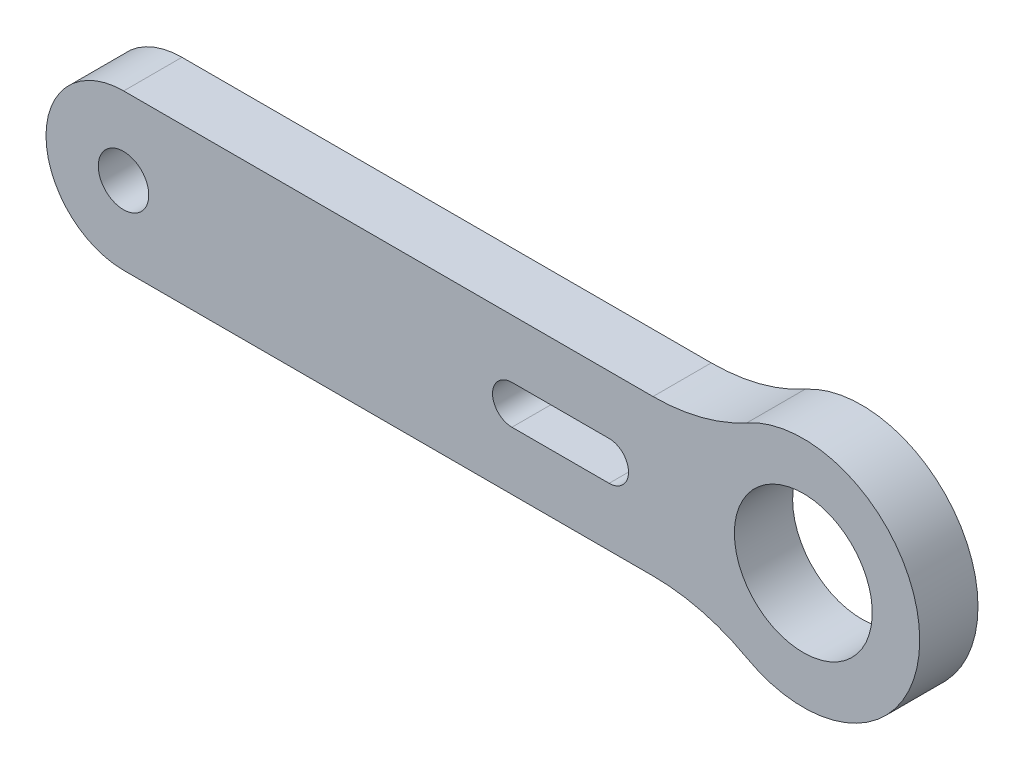
ISO-10303-21;
HEADER;
FILE_DESCRIPTION(('STEP AP214'),'2;1');
FILE_NAME('part.step','',(''),(''),'','','');
FILE_SCHEMA(('AUTOMOTIVE_DESIGN { 1 0 10303 214 1 1 1 1 }'));
ENDSEC;
DATA;
#1=APPLICATION_CONTEXT('core data for automotive mechanical design processes');
#2=APPLICATION_PROTOCOL_DEFINITION('international standard','automotive_design',2000,#1);
#3=PRODUCT_CONTEXT('',#1,'mechanical');
#4=PRODUCT('Part','Part','',(#3));
#5=PRODUCT_RELATED_PRODUCT_CATEGORY('part','',(#4));
#6=PRODUCT_DEFINITION_FORMATION('','',#4);
#7=PRODUCT_DEFINITION_CONTEXT('part definition',#1,'design');
#8=PRODUCT_DEFINITION('design','',#6,#7);
#9=PRODUCT_DEFINITION_SHAPE('','',#8);
#10=(LENGTH_UNIT() NAMED_UNIT(*) SI_UNIT(.MILLI.,.METRE.));
#11=(NAMED_UNIT(*) PLANE_ANGLE_UNIT() SI_UNIT($,.RADIAN.));
#12=(NAMED_UNIT(*) SI_UNIT($,.STERADIAN.) SOLID_ANGLE_UNIT());
#13=UNCERTAINTY_MEASURE_WITH_UNIT(LENGTH_MEASURE(1.E-05),#10,'distance_accuracy_value','');
#14=(GEOMETRIC_REPRESENTATION_CONTEXT(3) GLOBAL_UNCERTAINTY_ASSIGNED_CONTEXT((#13)) GLOBAL_UNIT_ASSIGNED_CONTEXT((#10,
#11,#12)) REPRESENTATION_CONTEXT('',''));
#15=CARTESIAN_POINT('',(0.,0.,0.));
#16=DIRECTION('',(0.,0.,1.));
#17=DIRECTION('',(1.,0.,0.));
#18=AXIS2_PLACEMENT_3D('',#15,#16,#17);
#19=CARTESIAN_POINT('',(-11.6110208815812,4.,0.));
#20=DIRECTION('',(0.,0.,1.));
#21=DIRECTION('',(1.,0.,0.));
#22=AXIS2_PLACEMENT_3D('',#19,#20,#21);
#23=CYLINDRICAL_SURFACE('',#22,4.);
#24=CARTESIAN_POINT('',(-11.6110208815812,4.,3.));
#25=DIRECTION('',(0.,0.,1.));
#26=DIRECTION('',(1.,0.,0.));
#27=AXIS2_PLACEMENT_3D('',#24,#25,#26);
#28=CIRCLE('',#27,4.);
#29=CARTESIAN_POINT('',(-11.6110208815812,8.,3.));
#30=VERTEX_POINT('',#29);
#31=CARTESIAN_POINT('',(-11.6110208815812,0.,3.));
#32=VERTEX_POINT('',#31);
#33=EDGE_CURVE('E150',#30,#32,#28,.T.);
#34=ORIENTED_EDGE('',*,*,#33,.F.);
#35=DIRECTION('',(0.,0.,1.));
#36=VECTOR('',#35,1.);
#37=CARTESIAN_POINT('',(-11.6110208815812,8.,0.));
#38=LINE('',#37,#36);
#39=CARTESIAN_POINT('',(-11.6110208815812,8.,0.));
#40=VERTEX_POINT('',#39);
#41=EDGE_CURVE('E11',#40,#30,#38,.T.);
#42=ORIENTED_EDGE('',*,*,#41,.F.);
#43=CARTESIAN_POINT('',(-11.6110208815812,4.,0.));
#44=DIRECTION('',(0.,0.,1.));
#45=DIRECTION('',(1.,0.,0.));
#46=AXIS2_PLACEMENT_3D('',#43,#44,#45);
#47=CIRCLE('',#46,4.);
#48=CARTESIAN_POINT('',(-11.6110208815812,0.,0.));
#49=VERTEX_POINT('',#48);
#50=EDGE_CURVE('E154',#40,#49,#47,.T.);
#51=ORIENTED_EDGE('',*,*,#50,.T.);
#52=DIRECTION('',(0.,0.,1.));
#53=VECTOR('',#52,1.);
#54=CARTESIAN_POINT('',(-11.6110208815812,0.,0.));
#55=LINE('',#54,#53);
#56=EDGE_CURVE('E39',#49,#32,#55,.T.);
#57=ORIENTED_EDGE('',*,*,#56,.T.);
#58=EDGE_LOOP('',(#34,#42,#51,#57));
#59=FACE_BOUND('',#58,.T.);
#60=ADVANCED_FACE('F36',(#59),#23,.T.);
#61=CARTESIAN_POINT('',(15.6408231399763,8.,0.));
#62=DIRECTION('',(0.,1.,0.));
#63=DIRECTION('',(0.,0.,1.));
#64=AXIS2_PLACEMENT_3D('',#61,#62,#63);
#65=PLANE('',#64);
#66=DIRECTION('',(-1.,0.,0.));
#67=VECTOR('',#66,1.);
#68=CARTESIAN_POINT('',(15.6408231399763,8.,3.));
#69=LINE('',#68,#67);
#70=CARTESIAN_POINT('',(15.6408231399763,8.,3.));
#71=VERTEX_POINT('',#70);
#72=EDGE_CURVE('E158',#71,#30,#69,.T.);
#73=ORIENTED_EDGE('',*,*,#72,.F.);
#74=DIRECTION('',(0.,0.,1.));
#75=VECTOR('',#74,1.);
#76=CARTESIAN_POINT('',(15.6408231399763,8.,0.));
#77=LINE('',#76,#75);
#78=CARTESIAN_POINT('',(15.6408231399763,8.,0.));
#79=VERTEX_POINT('',#78);
#80=EDGE_CURVE('E44',#79,#71,#77,.T.);
#81=ORIENTED_EDGE('',*,*,#80,.F.);
#82=DIRECTION('',(-1.,0.,0.));
#83=VECTOR('',#82,1.);
#84=CARTESIAN_POINT('',(15.6408231399763,8.,0.));
#85=LINE('',#84,#83);
#86=EDGE_CURVE('E170',#79,#40,#85,.T.);
#87=ORIENTED_EDGE('',*,*,#86,.T.);
#88=ORIENTED_EDGE('',*,*,#41,.T.);
#89=EDGE_LOOP('',(#73,#81,#87,#88));
#90=FACE_BOUND('',#89,.T.);
#91=ADVANCED_FACE('F207',(#90),#65,.T.);
#92=CARTESIAN_POINT('',(15.6408231399763,18.,0.));
#93=DIRECTION('',(0.,0.,1.));
#94=DIRECTION('',(1.,0.,0.));
#95=AXIS2_PLACEMENT_3D('',#92,#93,#94);
#96=CYLINDRICAL_SURFACE('',#95,10.);
#97=CARTESIAN_POINT('',(15.6408231399763,18.,3.));
#98=DIRECTION('',(0.,0.,-1.));
#99=DIRECTION('',(-1.,0.,0.));
#100=AXIS2_PLACEMENT_3D('',#97,#98,#99);
#101=CIRCLE('',#100,10.);
#102=CARTESIAN_POINT('',(20.4784035436222,9.24798218476098,3.));
#103=VERTEX_POINT('',#102);
#104=EDGE_CURVE('E184',#103,#71,#101,.T.);
#105=ORIENTED_EDGE('',*,*,#104,.F.);
#106=DIRECTION('',(0.,0.,1.));
#107=VECTOR('',#106,1.);
#108=CARTESIAN_POINT('',(20.4784035436222,9.24798218476098,0.));
#109=LINE('',#108,#107);
#110=CARTESIAN_POINT('',(20.4784035436222,9.24798218476098,0.));
#111=VERTEX_POINT('',#110);
#112=EDGE_CURVE('E190',#111,#103,#109,.T.);
#113=ORIENTED_EDGE('',*,*,#112,.F.);
#114=CARTESIAN_POINT('',(15.6408231399763,18.,0.));
#115=DIRECTION('',(0.,0.,-1.));
#116=DIRECTION('',(-1.,0.,0.));
#117=AXIS2_PLACEMENT_3D('',#114,#115,#116);
#118=CIRCLE('',#117,10.);
#119=EDGE_CURVE('E167',#111,#79,#118,.T.);
#120=ORIENTED_EDGE('',*,*,#119,.T.);
#121=ORIENTED_EDGE('',*,*,#80,.T.);
#122=EDGE_LOOP('',(#105,#113,#120,#121));
#123=FACE_BOUND('',#122,.T.);
#124=ADVANCED_FACE('F218',(#123),#96,.F.);
#125=CARTESIAN_POINT('',(23.3783422515076,4.00149259352111,0.));
#126=DIRECTION('',(0.,0.,1.));
#127=DIRECTION('',(1.,0.,0.));
#128=AXIS2_PLACEMENT_3D('',#125,#126,#127);
#129=CYLINDRICAL_SURFACE('',#128,5.99460570350378);
#130=CARTESIAN_POINT('',(23.3783422515076,4.00149259352111,3.));
#131=DIRECTION('',(0.,0.,1.));
#132=DIRECTION('',(1.,0.,0.));
#133=AXIS2_PLACEMENT_3D('',#130,#131,#132);
#134=CIRCLE('',#133,5.99460570350378);
#135=CARTESIAN_POINT('',(20.4804285975604,-1.24611581362463,3.));
#136=VERTEX_POINT('',#135);
#137=EDGE_CURVE('E181',#136,#103,#134,.T.);
#138=ORIENTED_EDGE('',*,*,#137,.F.);
#139=DIRECTION('',(0.,0.,1.));
#140=VECTOR('',#139,1.);
#141=CARTESIAN_POINT('',(20.4804285975604,-1.24611581362463,0.));
#142=LINE('',#141,#140);
#143=CARTESIAN_POINT('',(20.4804285975604,-1.24611581362463,0.));
#144=VERTEX_POINT('',#143);
#145=EDGE_CURVE('E192',#144,#136,#142,.T.);
#146=ORIENTED_EDGE('',*,*,#145,.F.);
#147=CARTESIAN_POINT('',(23.3783422515076,4.00149259352111,0.));
#148=DIRECTION('',(0.,0.,1.));
#149=DIRECTION('',(1.,0.,0.));
#150=AXIS2_PLACEMENT_3D('',#147,#148,#149);
#151=CIRCLE('',#150,5.99460570350378);
#152=EDGE_CURVE('E164',#144,#111,#151,.T.);
#153=ORIENTED_EDGE('',*,*,#152,.T.);
#154=ORIENTED_EDGE('',*,*,#112,.T.);
#155=EDGE_LOOP('',(#138,#146,#153,#154));
#156=FACE_BOUND('',#155,.T.);
#157=ADVANCED_FACE('F216',(#156),#129,.T.);
#158=CARTESIAN_POINT('',(15.6462263209147,-10.,0.));
#159=DIRECTION('',(0.,0.,1.));
#160=DIRECTION('',(1.,0.,0.));
#161=AXIS2_PLACEMENT_3D('',#158,#159,#160);
#162=CYLINDRICAL_SURFACE('',#161,10.);
#163=CARTESIAN_POINT('',(15.6462263209147,-10.,3.));
#164=DIRECTION('',(0.,0.,-1.));
#165=DIRECTION('',(-1.,0.,0.));
#166=AXIS2_PLACEMENT_3D('',#163,#164,#165);
#167=CIRCLE('',#166,10.);
#168=CARTESIAN_POINT('',(15.6462263209147,0.,3.));
#169=VERTEX_POINT('',#168);
#170=EDGE_CURVE('E178',#169,#136,#167,.T.);
#171=ORIENTED_EDGE('',*,*,#170,.F.);
#172=DIRECTION('',(0.,0.,1.));
#173=VECTOR('',#172,1.);
#174=CARTESIAN_POINT('',(15.6462263209147,0.,0.));
#175=LINE('',#174,#173);
#176=CARTESIAN_POINT('',(15.6462263209147,0.,0.));
#177=VERTEX_POINT('',#176);
#178=EDGE_CURVE('E193',#177,#169,#175,.T.);
#179=ORIENTED_EDGE('',*,*,#178,.F.);
#180=CARTESIAN_POINT('',(15.6462263209147,-10.,0.));
#181=DIRECTION('',(0.,0.,-1.));
#182=DIRECTION('',(-1.,0.,0.));
#183=AXIS2_PLACEMENT_3D('',#180,#181,#182);
#184=CIRCLE('',#183,10.);
#185=EDGE_CURVE('E161',#177,#144,#184,.T.);
#186=ORIENTED_EDGE('',*,*,#185,.T.);
#187=ORIENTED_EDGE('',*,*,#145,.T.);
#188=EDGE_LOOP('',(#171,#179,#186,#187));
#189=FACE_BOUND('',#188,.T.);
#190=ADVANCED_FACE('F213',(#189),#162,.F.);
#191=CARTESIAN_POINT('',(-11.6110208815812,0.,0.));
#192=DIRECTION('',(0.,-1.,0.));
#193=DIRECTION('',(0.,0.,-1.));
#194=AXIS2_PLACEMENT_3D('',#191,#192,#193);
#195=PLANE('',#194);
#196=DIRECTION('',(1.,0.,0.));
#197=VECTOR('',#196,1.);
#198=CARTESIAN_POINT('',(-11.6110208815812,0.,3.));
#199=LINE('',#198,#197);
#200=EDGE_CURVE('E175',#32,#169,#199,.T.);
#201=ORIENTED_EDGE('',*,*,#200,.F.);
#202=ORIENTED_EDGE('',*,*,#56,.F.);
#203=DIRECTION('',(1.,0.,0.));
#204=VECTOR('',#203,1.);
#205=CARTESIAN_POINT('',(-11.6110208815812,0.,0.));
#206=LINE('',#205,#204);
#207=EDGE_CURVE('E157',#49,#177,#206,.T.);
#208=ORIENTED_EDGE('',*,*,#207,.T.);
#209=ORIENTED_EDGE('',*,*,#178,.T.);
#210=EDGE_LOOP('',(#201,#202,#208,#209));
#211=FACE_BOUND('',#210,.T.);
#212=ADVANCED_FACE('F201',(#211),#195,.T.);
#213=CARTESIAN_POINT('',(-11.6110208815812,4.,0.));
#214=DIRECTION('',(0.,0.,1.));
#215=DIRECTION('',(1.,0.,0.));
#216=AXIS2_PLACEMENT_3D('',#213,#214,#215);
#217=PLANE('',#216);
#218=CARTESIAN_POINT('',(-11.6193859771087,4.00018272906783,0.));
#219=DIRECTION('',(0.,0.,1.));
#220=DIRECTION('',(-1.,0.,0.));
#221=AXIS2_PLACEMENT_3D('',#218,#219,#220);
#222=CIRCLE('',#221,1.3);
#223=CARTESIAN_POINT('',(-12.9193859771087,4.00018272906783,0.));
#224=VERTEX_POINT('',#223);
#225=EDGE_CURVE('E339',#224,#224,#222,.T.);
#226=ORIENTED_EDGE('',*,*,#225,.T.);
#227=EDGE_LOOP('',(#226));
#228=FACE_BOUND('',#227,.T.);
#229=CARTESIAN_POINT('',(23.3793348450287,4.00050000000005,0.));
#230=DIRECTION('',(0.,0.,1.));
#231=DIRECTION('',(-1.,0.,0.));
#232=AXIS2_PLACEMENT_3D('',#229,#230,#231);
#233=CIRCLE('',#232,3.55);
#234=CARTESIAN_POINT('',(19.8293348450287,4.00050000000005,0.));
#235=VERTEX_POINT('',#234);
#236=EDGE_CURVE('E144',#235,#235,#233,.T.);
#237=ORIENTED_EDGE('',*,*,#236,.T.);
#238=EDGE_LOOP('',(#237));
#239=FACE_BOUND('',#238,.T.);
#240=DIRECTION('',(-1.,0.,0.));
#241=VECTOR('',#240,1.);
#242=CARTESIAN_POINT('',(8.37884739844319,5.,0.));
#243=LINE('',#242,#241);
#244=CARTESIAN_POINT('',(13.3803806473393,4.99999999999999,0.));
#245=VERTEX_POINT('',#244);
#246=CARTESIAN_POINT('',(8.37884739844319,5.,0.));
#247=VERTEX_POINT('',#246);
#248=EDGE_CURVE('E121',#245,#247,#243,.T.);
#249=ORIENTED_EDGE('',*,*,#248,.T.);
#250=CARTESIAN_POINT('',(8.37884739844319,4.00026662444805,0.));
#251=DIRECTION('',(0.,0.,1.));
#252=DIRECTION('',(-1.,0.,0.));
#253=AXIS2_PLACEMENT_3D('',#250,#251,#252);
#254=CIRCLE('',#253,0.999733375551945);
#255=CARTESIAN_POINT('',(8.37884739844319,3.00053324889611,0.));
#256=VERTEX_POINT('',#255);
#257=EDGE_CURVE('E115',#247,#256,#254,.T.);
#258=ORIENTED_EDGE('',*,*,#257,.T.);
#259=DIRECTION('',(1.,0.,0.));
#260=VECTOR('',#259,1.);
#261=CARTESIAN_POINT('',(13.3803806473393,3.00053324889611,0.));
#262=LINE('',#261,#260);
#263=CARTESIAN_POINT('',(13.3803806473393,3.00053324889611,0.));
#264=VERTEX_POINT('',#263);
#265=EDGE_CURVE('E124',#256,#264,#262,.T.);
#266=ORIENTED_EDGE('',*,*,#265,.T.);
#267=CARTESIAN_POINT('',(13.3803806473393,4.00026662444805,0.));
#268=DIRECTION('',(0.,0.,1.));
#269=DIRECTION('',(-1.,0.,0.));
#270=AXIS2_PLACEMENT_3D('',#267,#268,#269);
#271=CIRCLE('',#270,0.999733375551945);
#272=EDGE_CURVE('E52',#264,#245,#271,.T.);
#273=ORIENTED_EDGE('',*,*,#272,.T.);
#274=EDGE_LOOP('',(#249,#258,#266,#273));
#275=FACE_BOUND('',#274,.T.);
#276=ORIENTED_EDGE('',*,*,#50,.F.);
#277=ORIENTED_EDGE('',*,*,#86,.F.);
#278=ORIENTED_EDGE('',*,*,#119,.F.);
#279=ORIENTED_EDGE('',*,*,#152,.F.);
#280=ORIENTED_EDGE('',*,*,#185,.F.);
#281=ORIENTED_EDGE('',*,*,#207,.F.);
#282=EDGE_LOOP('',(#276,#277,#278,#279,#280,#281));
#283=FACE_BOUND('',#282,.T.);
#284=ADVANCED_FACE('F128',(#228,#239,#275,#283),#217,.F.);
#285=CARTESIAN_POINT('',(-11.6110208815812,4.,3.));
#286=DIRECTION('',(0.,0.,1.));
#287=DIRECTION('',(1.,0.,0.));
#288=AXIS2_PLACEMENT_3D('',#285,#286,#287);
#289=PLANE('',#288);
#290=CARTESIAN_POINT('',(-11.6193859771087,4.00018272906783,3.));
#291=DIRECTION('',(0.,0.,1.));
#292=DIRECTION('',(-1.,0.,0.));
#293=AXIS2_PLACEMENT_3D('',#290,#291,#292);
#294=CIRCLE('',#293,1.3);
#295=CARTESIAN_POINT('',(-12.9193859771087,4.00018272906783,3.));
#296=VERTEX_POINT('',#295);
#297=EDGE_CURVE('E342',#296,#296,#294,.T.);
#298=ORIENTED_EDGE('',*,*,#297,.F.);
#299=EDGE_LOOP('',(#298));
#300=FACE_BOUND('',#299,.T.);
#301=CARTESIAN_POINT('',(23.3793348450287,4.00050000000005,3.));
#302=DIRECTION('',(0.,0.,1.));
#303=DIRECTION('',(-1.,0.,0.));
#304=AXIS2_PLACEMENT_3D('',#301,#302,#303);
#305=CIRCLE('',#304,3.55);
#306=CARTESIAN_POINT('',(19.8293348450287,4.00050000000005,3.));
#307=VERTEX_POINT('',#306);
#308=EDGE_CURVE('E137',#307,#307,#305,.T.);
#309=ORIENTED_EDGE('',*,*,#308,.F.);
#310=EDGE_LOOP('',(#309));
#311=FACE_BOUND('',#310,.T.);
#312=CARTESIAN_POINT('',(8.37884739844319,4.00026662444805,3.));
#313=DIRECTION('',(0.,0.,1.));
#314=DIRECTION('',(-1.,0.,0.));
#315=AXIS2_PLACEMENT_3D('',#312,#313,#314);
#316=CIRCLE('',#315,0.999733375551945);
#317=CARTESIAN_POINT('',(8.37884739844319,5.,3.));
#318=VERTEX_POINT('',#317);
#319=CARTESIAN_POINT('',(8.37884739844319,3.00053324889611,3.));
#320=VERTEX_POINT('',#319);
#321=EDGE_CURVE('E60',#318,#320,#316,.T.);
#322=ORIENTED_EDGE('',*,*,#321,.F.);
#323=DIRECTION('',(-1.,0.,0.));
#324=VECTOR('',#323,1.);
#325=CARTESIAN_POINT('',(8.37884739844319,5.,3.));
#326=LINE('',#325,#324);
#327=CARTESIAN_POINT('',(13.3803806473393,4.99999999999999,3.));
#328=VERTEX_POINT('',#327);
#329=EDGE_CURVE('E131',#328,#318,#326,.T.);
#330=ORIENTED_EDGE('',*,*,#329,.F.);
#331=CARTESIAN_POINT('',(13.3803806473393,4.00026662444805,3.));
#332=DIRECTION('',(0.,0.,1.));
#333=DIRECTION('',(-1.,0.,0.));
#334=AXIS2_PLACEMENT_3D('',#331,#332,#333);
#335=CIRCLE('',#334,0.999733375551945);
#336=CARTESIAN_POINT('',(13.3803806473393,3.00053324889611,3.));
#337=VERTEX_POINT('',#336);
#338=EDGE_CURVE('E134',#337,#328,#335,.T.);
#339=ORIENTED_EDGE('',*,*,#338,.F.);
#340=DIRECTION('',(1.,0.,0.));
#341=VECTOR('',#340,1.);
#342=CARTESIAN_POINT('',(13.3803806473393,3.00053324889611,3.));
#343=LINE('',#342,#341);
#344=EDGE_CURVE('E143',#320,#337,#343,.T.);
#345=ORIENTED_EDGE('',*,*,#344,.F.);
#346=EDGE_LOOP('',(#322,#330,#339,#345));
#347=FACE_BOUND('',#346,.T.);
#348=ORIENTED_EDGE('',*,*,#33,.T.);
#349=ORIENTED_EDGE('',*,*,#200,.T.);
#350=ORIENTED_EDGE('',*,*,#170,.T.);
#351=ORIENTED_EDGE('',*,*,#137,.T.);
#352=ORIENTED_EDGE('',*,*,#104,.T.);
#353=ORIENTED_EDGE('',*,*,#72,.T.);
#354=EDGE_LOOP('',(#348,#349,#350,#351,#352,#353));
#355=FACE_BOUND('',#354,.T.);
#356=ADVANCED_FACE('F203',(#300,#311,#347,#355),#289,.T.);
#357=CARTESIAN_POINT('',(8.37884739844319,4.00026662444805,0.));
#358=DIRECTION('',(0.,0.,1.));
#359=DIRECTION('',(1.,0.,0.));
#360=AXIS2_PLACEMENT_3D('',#357,#358,#359);
#361=CYLINDRICAL_SURFACE('',#360,0.999733375551945);
#362=ORIENTED_EDGE('',*,*,#321,.T.);
#363=DIRECTION('',(0.,0.,1.));
#364=VECTOR('',#363,1.);
#365=CARTESIAN_POINT('',(8.37884739844319,3.00053324889611,0.));
#366=LINE('',#365,#364);
#367=EDGE_CURVE('E111',#256,#320,#366,.T.);
#368=ORIENTED_EDGE('',*,*,#367,.F.);
#369=ORIENTED_EDGE('',*,*,#257,.F.);
#370=DIRECTION('',(0.,0.,1.));
#371=VECTOR('',#370,1.);
#372=CARTESIAN_POINT('',(8.37884739844319,5.,0.));
#373=LINE('',#372,#371);
#374=EDGE_CURVE('E148',#247,#318,#373,.T.);
#375=ORIENTED_EDGE('',*,*,#374,.T.);
#376=EDGE_LOOP('',(#362,#368,#369,#375));
#377=FACE_BOUND('',#376,.T.);
#378=ADVANCED_FACE('F113',(#377),#361,.F.);
#379=CARTESIAN_POINT('',(8.37884739844319,5.,0.));
#380=DIRECTION('',(0.,1.,0.));
#381=DIRECTION('',(0.,0.,1.));
#382=AXIS2_PLACEMENT_3D('',#379,#380,#381);
#383=PLANE('',#382);
#384=ORIENTED_EDGE('',*,*,#329,.T.);
#385=ORIENTED_EDGE('',*,*,#374,.F.);
#386=ORIENTED_EDGE('',*,*,#248,.F.);
#387=DIRECTION('',(0.,0.,1.));
#388=VECTOR('',#387,1.);
#389=CARTESIAN_POINT('',(13.3803806473393,4.99999999999999,0.));
#390=LINE('',#389,#388);
#391=EDGE_CURVE('E151',#245,#328,#390,.T.);
#392=ORIENTED_EDGE('',*,*,#391,.T.);
#393=EDGE_LOOP('',(#384,#385,#386,#392));
#394=FACE_BOUND('',#393,.T.);
#395=ADVANCED_FACE('F286',(#394),#383,.F.);
#396=CARTESIAN_POINT('',(13.3803806473393,4.00026662444805,0.));
#397=DIRECTION('',(0.,0.,1.));
#398=DIRECTION('',(1.,0.,0.));
#399=AXIS2_PLACEMENT_3D('',#396,#397,#398);
#400=CYLINDRICAL_SURFACE('',#399,0.999733375551945);
#401=ORIENTED_EDGE('',*,*,#338,.T.);
#402=ORIENTED_EDGE('',*,*,#391,.F.);
#403=ORIENTED_EDGE('',*,*,#272,.F.);
#404=DIRECTION('',(0.,0.,1.));
#405=VECTOR('',#404,1.);
#406=CARTESIAN_POINT('',(13.3803806473393,3.00053324889611,0.));
#407=LINE('',#406,#405);
#408=EDGE_CURVE('E120',#264,#337,#407,.T.);
#409=ORIENTED_EDGE('',*,*,#408,.T.);
#410=EDGE_LOOP('',(#401,#402,#403,#409));
#411=FACE_BOUND('',#410,.T.);
#412=ADVANCED_FACE('F295',(#411),#400,.F.);
#413=CARTESIAN_POINT('',(13.3803806473393,3.00053324889611,0.));
#414=DIRECTION('',(0.,-1.,0.));
#415=DIRECTION('',(0.,0.,-1.));
#416=AXIS2_PLACEMENT_3D('',#413,#414,#415);
#417=PLANE('',#416);
#418=ORIENTED_EDGE('',*,*,#344,.T.);
#419=ORIENTED_EDGE('',*,*,#408,.F.);
#420=ORIENTED_EDGE('',*,*,#265,.F.);
#421=ORIENTED_EDGE('',*,*,#367,.T.);
#422=EDGE_LOOP('',(#418,#419,#420,#421));
#423=FACE_BOUND('',#422,.T.);
#424=ADVANCED_FACE('F125',(#423),#417,.F.);
#425=CARTESIAN_POINT('',(23.3793348450287,4.00050000000005,0.));
#426=DIRECTION('',(0.,0.,1.));
#427=DIRECTION('',(1.,0.,0.));
#428=AXIS2_PLACEMENT_3D('',#425,#426,#427);
#429=CYLINDRICAL_SURFACE('',#428,3.55);
#430=ORIENTED_EDGE('',*,*,#236,.F.);
#431=EDGE_LOOP('',(#430));
#432=FACE_BOUND('',#431,.T.);
#433=ORIENTED_EDGE('',*,*,#308,.T.);
#434=EDGE_LOOP('',(#433));
#435=FACE_BOUND('',#434,.T.);
#436=ADVANCED_FACE('F313',(#432,#435),#429,.F.);
#437=CARTESIAN_POINT('',(-11.6193859771087,4.00018272906783,0.));
#438=DIRECTION('',(0.,0.,1.));
#439=DIRECTION('',(1.,0.,0.));
#440=AXIS2_PLACEMENT_3D('',#437,#438,#439);
#441=CYLINDRICAL_SURFACE('',#440,1.3);
#442=ORIENTED_EDGE('',*,*,#225,.F.);
#443=EDGE_LOOP('',(#442));
#444=FACE_BOUND('',#443,.T.);
#445=ORIENTED_EDGE('',*,*,#297,.T.);
#446=EDGE_LOOP('',(#445));
#447=FACE_BOUND('',#446,.T.);
#448=ADVANCED_FACE('F322',(#444,#447),#441,.F.);
#449=CLOSED_SHELL('',(#60,#91,#124,#157,#190,#212,#284,#356,#378,#395,#412,#424,#436,#448));
#450=MANIFOLD_SOLID_BREP('B2',#449);
#451=ADVANCED_BREP_SHAPE_REPRESENTATION('',(#18,#450),#14);
#452=SHAPE_DEFINITION_REPRESENTATION(#9,#451);
ENDSEC;
END-ISO-10303-21;
